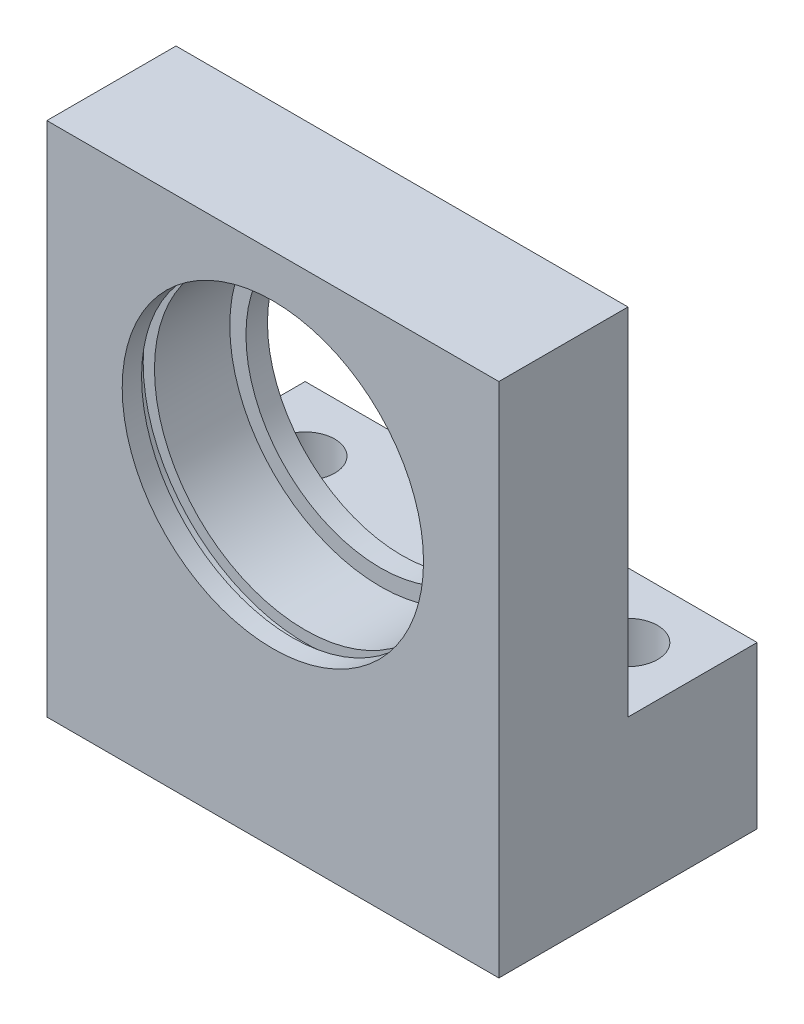
ISO-10303-21;
HEADER;
FILE_DESCRIPTION(('STEP AP214'),'2;1');
FILE_NAME('part.step','',(''),(''),'','','');
FILE_SCHEMA(('AUTOMOTIVE_DESIGN { 1 0 10303 214 1 1 1 1 }'));
ENDSEC;
DATA;
#1=APPLICATION_CONTEXT('core data for automotive mechanical design processes');
#2=APPLICATION_PROTOCOL_DEFINITION('international standard','automotive_design',2000,#1);
#3=PRODUCT_CONTEXT('',#1,'mechanical');
#4=PRODUCT('Part','Part','',(#3));
#5=PRODUCT_RELATED_PRODUCT_CATEGORY('part','',(#4));
#6=PRODUCT_DEFINITION_FORMATION('','',#4);
#7=PRODUCT_DEFINITION_CONTEXT('part definition',#1,'design');
#8=PRODUCT_DEFINITION('design','',#6,#7);
#9=PRODUCT_DEFINITION_SHAPE('','',#8);
#10=(LENGTH_UNIT() NAMED_UNIT(*) SI_UNIT(.MILLI.,.METRE.));
#11=(NAMED_UNIT(*) PLANE_ANGLE_UNIT() SI_UNIT($,.RADIAN.));
#12=(NAMED_UNIT(*) SI_UNIT($,.STERADIAN.) SOLID_ANGLE_UNIT());
#13=UNCERTAINTY_MEASURE_WITH_UNIT(LENGTH_MEASURE(1.E-05),#10,'distance_accuracy_value','');
#14=(GEOMETRIC_REPRESENTATION_CONTEXT(3) GLOBAL_UNCERTAINTY_ASSIGNED_CONTEXT((#13)) GLOBAL_UNIT_ASSIGNED_CONTEXT((#10,
#11,#12)) REPRESENTATION_CONTEXT('',''));
#15=CARTESIAN_POINT('',(0.,0.,0.));
#16=DIRECTION('',(0.,0.,1.));
#17=DIRECTION('',(1.,0.,0.));
#18=AXIS2_PLACEMENT_3D('',#15,#16,#17);
#19=CARTESIAN_POINT('',(21.,18.,-12.));
#20=DIRECTION('',(0.,-1.,0.));
#21=DIRECTION('',(0.,0.,-1.));
#22=AXIS2_PLACEMENT_3D('',#19,#20,#21);
#23=PLANE('',#22);
#24=DIRECTION('',(0.,0.,1.));
#25=VECTOR('',#24,1.);
#26=CARTESIAN_POINT('',(-21.,18.,-12.));
#27=LINE('',#26,#25);
#28=CARTESIAN_POINT('',(-21.,18.,-12.));
#29=VERTEX_POINT('',#28);
#30=CARTESIAN_POINT('',(-21.,18.,0.));
#31=VERTEX_POINT('',#30);
#32=EDGE_CURVE('E84',#29,#31,#27,.T.);
#33=ORIENTED_EDGE('',*,*,#32,.T.);
#34=DIRECTION('',(-1.,0.,0.));
#35=VECTOR('',#34,1.);
#36=CARTESIAN_POINT('',(21.,18.,0.));
#37=LINE('',#36,#35);
#38=CARTESIAN_POINT('',(21.,18.,0.));
#39=VERTEX_POINT('',#38);
#40=EDGE_CURVE('E73',#39,#31,#37,.T.);
#41=ORIENTED_EDGE('',*,*,#40,.F.);
#42=DIRECTION('',(0.,0.,1.));
#43=VECTOR('',#42,1.);
#44=CARTESIAN_POINT('',(21.,18.,-12.));
#45=LINE('',#44,#43);
#46=CARTESIAN_POINT('',(21.,18.,-12.));
#47=VERTEX_POINT('',#46);
#48=EDGE_CURVE('E83',#47,#39,#45,.T.);
#49=ORIENTED_EDGE('',*,*,#48,.F.);
#50=DIRECTION('',(-1.,0.,0.));
#51=VECTOR('',#50,1.);
#52=CARTESIAN_POINT('',(21.,18.,-12.));
#53=LINE('',#52,#51);
#54=EDGE_CURVE('E96',#47,#29,#53,.T.);
#55=ORIENTED_EDGE('',*,*,#54,.T.);
#56=EDGE_LOOP('',(#33,#41,#49,#55));
#57=FACE_BOUND('',#56,.T.);
#58=ADVANCED_FACE('F17',(#57),#23,.F.);
#59=CARTESIAN_POINT('',(-21.,0.,0.));
#60=DIRECTION('',(1.,0.,0.));
#61=DIRECTION('',(0.,0.,-1.));
#62=AXIS2_PLACEMENT_3D('',#59,#60,#61);
#63=PLANE('',#62);
#64=ORIENTED_EDGE('',*,*,#32,.F.);
#65=DIRECTION('',(0.,1.,0.));
#66=VECTOR('',#65,1.);
#67=CARTESIAN_POINT('',(-21.,-15.,-12.));
#68=LINE('',#67,#66);
#69=CARTESIAN_POINT('',(-21.,-15.,-12.));
#70=VERTEX_POINT('',#69);
#71=EDGE_CURVE('E107',#70,#29,#68,.T.);
#72=ORIENTED_EDGE('',*,*,#71,.F.);
#73=DIRECTION('',(0.,0.,1.));
#74=VECTOR('',#73,1.);
#75=CARTESIAN_POINT('',(-21.,-15.,-24.));
#76=LINE('',#75,#74);
#77=CARTESIAN_POINT('',(-21.,-15.,-24.));
#78=VERTEX_POINT('',#77);
#79=EDGE_CURVE('E111',#78,#70,#76,.T.);
#80=ORIENTED_EDGE('',*,*,#79,.F.);
#81=DIRECTION('',(0.,1.,0.));
#82=VECTOR('',#81,1.);
#83=CARTESIAN_POINT('',(-21.,-30.,-24.));
#84=LINE('',#83,#82);
#85=CARTESIAN_POINT('',(-21.,-30.,-24.));
#86=VERTEX_POINT('',#85);
#87=EDGE_CURVE('E115',#86,#78,#84,.T.);
#88=ORIENTED_EDGE('',*,*,#87,.F.);
#89=DIRECTION('',(0.,0.,-1.));
#90=VECTOR('',#89,1.);
#91=CARTESIAN_POINT('',(-21.,-30.,0.));
#92=LINE('',#91,#90);
#93=CARTESIAN_POINT('',(-21.,-30.,0.));
#94=VERTEX_POINT('',#93);
#95=EDGE_CURVE('E92',#94,#86,#92,.T.);
#96=ORIENTED_EDGE('',*,*,#95,.F.);
#97=DIRECTION('',(0.,-1.,0.));
#98=VECTOR('',#97,1.);
#99=CARTESIAN_POINT('',(-21.,18.,0.));
#100=LINE('',#99,#98);
#101=EDGE_CURVE('E77',#31,#94,#100,.T.);
#102=ORIENTED_EDGE('',*,*,#101,.F.);
#103=EDGE_LOOP('',(#64,#72,#80,#88,#96,#102));
#104=FACE_BOUND('',#103,.T.);
#105=ADVANCED_FACE('F89',(#104),#63,.F.);
#106=CARTESIAN_POINT('',(21.,18.,0.));
#107=DIRECTION('',(0.,0.,-1.));
#108=DIRECTION('',(-1.,0.,0.));
#109=AXIS2_PLACEMENT_3D('',#106,#107,#108);
#110=PLANE('',#109);
#111=CARTESIAN_POINT('',(0.,0.,0.));
#112=DIRECTION('',(0.,0.,-1.));
#113=DIRECTION('',(-1.,0.,0.));
#114=AXIS2_PLACEMENT_3D('',#111,#112,#113);
#115=CIRCLE('',#114,14.);
#116=CARTESIAN_POINT('',(-14.,0.,0.));
#117=VERTEX_POINT('',#116);
#118=EDGE_CURVE('E93',#117,#117,#115,.T.);
#119=ORIENTED_EDGE('',*,*,#118,.T.);
#120=EDGE_LOOP('',(#119));
#121=FACE_BOUND('',#120,.T.);
#122=ORIENTED_EDGE('',*,*,#101,.T.);
#123=DIRECTION('',(-1.,0.,0.));
#124=VECTOR('',#123,1.);
#125=CARTESIAN_POINT('',(21.,-30.,0.));
#126=LINE('',#125,#124);
#127=CARTESIAN_POINT('',(21.,-30.,0.));
#128=VERTEX_POINT('',#127);
#129=EDGE_CURVE('E128',#128,#94,#126,.T.);
#130=ORIENTED_EDGE('',*,*,#129,.F.);
#131=DIRECTION('',(0.,-1.,0.));
#132=VECTOR('',#131,1.);
#133=CARTESIAN_POINT('',(21.,18.,0.));
#134=LINE('',#133,#132);
#135=EDGE_CURVE('E79',#39,#128,#134,.T.);
#136=ORIENTED_EDGE('',*,*,#135,.F.);
#137=ORIENTED_EDGE('',*,*,#40,.T.);
#138=EDGE_LOOP('',(#122,#130,#136,#137));
#139=FACE_BOUND('',#138,.T.);
#140=ADVANCED_FACE('F75',(#121,#139),#110,.F.);
#141=CARTESIAN_POINT('',(21.,0.,0.));
#142=DIRECTION('',(1.,0.,0.));
#143=DIRECTION('',(0.,0.,-1.));
#144=AXIS2_PLACEMENT_3D('',#141,#142,#143);
#145=PLANE('',#144);
#146=ORIENTED_EDGE('',*,*,#48,.T.);
#147=ORIENTED_EDGE('',*,*,#135,.T.);
#148=DIRECTION('',(0.,0.,-1.));
#149=VECTOR('',#148,1.);
#150=CARTESIAN_POINT('',(21.,-30.,0.));
#151=LINE('',#150,#149);
#152=CARTESIAN_POINT('',(21.,-30.,-24.));
#153=VERTEX_POINT('',#152);
#154=EDGE_CURVE('E133',#128,#153,#151,.T.);
#155=ORIENTED_EDGE('',*,*,#154,.T.);
#156=DIRECTION('',(0.,1.,0.));
#157=VECTOR('',#156,1.);
#158=CARTESIAN_POINT('',(21.,-30.,-24.));
#159=LINE('',#158,#157);
#160=CARTESIAN_POINT('',(21.,-15.,-24.));
#161=VERTEX_POINT('',#160);
#162=EDGE_CURVE('E138',#153,#161,#159,.T.);
#163=ORIENTED_EDGE('',*,*,#162,.T.);
#164=DIRECTION('',(0.,0.,1.));
#165=VECTOR('',#164,1.);
#166=CARTESIAN_POINT('',(21.,-15.,-24.));
#167=LINE('',#166,#165);
#168=CARTESIAN_POINT('',(21.,-15.,-12.));
#169=VERTEX_POINT('',#168);
#170=EDGE_CURVE('E142',#161,#169,#167,.T.);
#171=ORIENTED_EDGE('',*,*,#170,.T.);
#172=DIRECTION('',(0.,1.,0.));
#173=VECTOR('',#172,1.);
#174=CARTESIAN_POINT('',(21.,-15.,-12.));
#175=LINE('',#174,#173);
#176=EDGE_CURVE('E146',#169,#47,#175,.T.);
#177=ORIENTED_EDGE('',*,*,#176,.T.);
#178=EDGE_LOOP('',(#146,#147,#155,#163,#171,#177));
#179=FACE_BOUND('',#178,.T.);
#180=ADVANCED_FACE('F213',(#179),#145,.T.);
#181=CARTESIAN_POINT('',(21.,-15.,-12.));
#182=DIRECTION('',(0.,0.,1.));
#183=DIRECTION('',(1.,0.,0.));
#184=AXIS2_PLACEMENT_3D('',#181,#182,#183);
#185=PLANE('',#184);
#186=CARTESIAN_POINT('',(0.,0.,-12.));
#187=DIRECTION('',(0.,0.,-1.));
#188=DIRECTION('',(-1.,0.,0.));
#189=AXIS2_PLACEMENT_3D('',#186,#187,#188);
#190=CIRCLE('',#189,12.5);
#191=CARTESIAN_POINT('',(-12.5,0.,-12.));
#192=VERTEX_POINT('',#191);
#193=EDGE_CURVE('E151',#192,#192,#190,.T.);
#194=ORIENTED_EDGE('',*,*,#193,.F.);
#195=EDGE_LOOP('',(#194));
#196=FACE_BOUND('',#195,.T.);
#197=ORIENTED_EDGE('',*,*,#71,.T.);
#198=ORIENTED_EDGE('',*,*,#54,.F.);
#199=ORIENTED_EDGE('',*,*,#176,.F.);
#200=DIRECTION('',(-1.,0.,0.));
#201=VECTOR('',#200,1.);
#202=CARTESIAN_POINT('',(21.,-15.,-12.));
#203=LINE('',#202,#201);
#204=EDGE_CURVE('E32',#169,#70,#203,.T.);
#205=ORIENTED_EDGE('',*,*,#204,.T.);
#206=EDGE_LOOP('',(#197,#198,#199,#205));
#207=FACE_BOUND('',#206,.T.);
#208=ADVANCED_FACE('F217',(#196,#207),#185,.F.);
#209=CARTESIAN_POINT('',(21.,-15.,-24.));
#210=DIRECTION('',(0.,-1.,0.));
#211=DIRECTION('',(0.,0.,-1.));
#212=AXIS2_PLACEMENT_3D('',#209,#210,#211);
#213=PLANE('',#212);
#214=CARTESIAN_POINT('',(15.,-15.,-18.));
#215=DIRECTION('',(0.,1.,0.));
#216=DIRECTION('',(1.,0.,0.));
#217=AXIS2_PLACEMENT_3D('',#214,#215,#216);
#218=CIRCLE('',#217,2.75);
#219=CARTESIAN_POINT('',(17.75,-15.,-18.));
#220=VERTEX_POINT('',#219);
#221=EDGE_CURVE('E157',#220,#220,#218,.T.);
#222=ORIENTED_EDGE('',*,*,#221,.F.);
#223=EDGE_LOOP('',(#222));
#224=FACE_BOUND('',#223,.T.);
#225=CARTESIAN_POINT('',(-15.,-15.,-18.));
#226=DIRECTION('',(0.,1.,0.));
#227=DIRECTION('',(1.,0.,0.));
#228=AXIS2_PLACEMENT_3D('',#225,#226,#227);
#229=CIRCLE('',#228,2.75);
#230=CARTESIAN_POINT('',(-12.25,-15.,-18.));
#231=VERTEX_POINT('',#230);
#232=EDGE_CURVE('E162',#231,#231,#229,.T.);
#233=ORIENTED_EDGE('',*,*,#232,.F.);
#234=EDGE_LOOP('',(#233));
#235=FACE_BOUND('',#234,.T.);
#236=ORIENTED_EDGE('',*,*,#79,.T.);
#237=ORIENTED_EDGE('',*,*,#204,.F.);
#238=ORIENTED_EDGE('',*,*,#170,.F.);
#239=DIRECTION('',(-1.,0.,0.));
#240=VECTOR('',#239,1.);
#241=CARTESIAN_POINT('',(21.,-15.,-24.));
#242=LINE('',#241,#240);
#243=EDGE_CURVE('E40',#161,#78,#242,.T.);
#244=ORIENTED_EDGE('',*,*,#243,.T.);
#245=EDGE_LOOP('',(#236,#237,#238,#244));
#246=FACE_BOUND('',#245,.T.);
#247=ADVANCED_FACE('F221',(#224,#235,#246),#213,.F.);
#248=CARTESIAN_POINT('',(21.,-30.,-24.));
#249=DIRECTION('',(0.,0.,1.));
#250=DIRECTION('',(1.,0.,0.));
#251=AXIS2_PLACEMENT_3D('',#248,#249,#250);
#252=PLANE('',#251);
#253=ORIENTED_EDGE('',*,*,#87,.T.);
#254=ORIENTED_EDGE('',*,*,#243,.F.);
#255=ORIENTED_EDGE('',*,*,#162,.F.);
#256=DIRECTION('',(-1.,0.,0.));
#257=VECTOR('',#256,1.);
#258=CARTESIAN_POINT('',(21.,-30.,-24.));
#259=LINE('',#258,#257);
#260=EDGE_CURVE('E166',#153,#86,#259,.T.);
#261=ORIENTED_EDGE('',*,*,#260,.T.);
#262=EDGE_LOOP('',(#253,#254,#255,#261));
#263=FACE_BOUND('',#262,.T.);
#264=ADVANCED_FACE('F225',(#263),#252,.F.);
#265=CARTESIAN_POINT('',(21.,-30.,0.));
#266=DIRECTION('',(0.,1.,0.));
#267=DIRECTION('',(0.,0.,1.));
#268=AXIS2_PLACEMENT_3D('',#265,#266,#267);
#269=PLANE('',#268);
#270=CARTESIAN_POINT('',(15.,-30.,-18.));
#271=DIRECTION('',(0.,1.,0.));
#272=DIRECTION('',(1.,0.,0.));
#273=AXIS2_PLACEMENT_3D('',#270,#271,#272);
#274=CIRCLE('',#273,2.75);
#275=CARTESIAN_POINT('',(17.75,-30.,-18.));
#276=VERTEX_POINT('',#275);
#277=EDGE_CURVE('E171',#276,#276,#274,.T.);
#278=ORIENTED_EDGE('',*,*,#277,.T.);
#279=EDGE_LOOP('',(#278));
#280=FACE_BOUND('',#279,.T.);
#281=CARTESIAN_POINT('',(-15.,-30.,-18.));
#282=DIRECTION('',(0.,1.,0.));
#283=DIRECTION('',(1.,0.,0.));
#284=AXIS2_PLACEMENT_3D('',#281,#282,#283);
#285=CIRCLE('',#284,2.75);
#286=CARTESIAN_POINT('',(-12.25,-30.,-18.));
#287=VERTEX_POINT('',#286);
#288=EDGE_CURVE('E176',#287,#287,#285,.T.);
#289=ORIENTED_EDGE('',*,*,#288,.T.);
#290=EDGE_LOOP('',(#289));
#291=FACE_BOUND('',#290,.T.);
#292=ORIENTED_EDGE('',*,*,#95,.T.);
#293=ORIENTED_EDGE('',*,*,#260,.F.);
#294=ORIENTED_EDGE('',*,*,#154,.F.);
#295=ORIENTED_EDGE('',*,*,#129,.T.);
#296=EDGE_LOOP('',(#292,#293,#294,#295));
#297=FACE_BOUND('',#296,.T.);
#298=ADVANCED_FACE('F229',(#280,#291,#297),#269,.F.);
#299=CARTESIAN_POINT('',(0.,0.,-12.));
#300=DIRECTION('',(0.,0.,-1.));
#301=DIRECTION('',(-1.,0.,0.));
#302=AXIS2_PLACEMENT_3D('',#299,#300,#301);
#303=CYLINDRICAL_SURFACE('',#302,14.);
#304=CARTESIAN_POINT('',(0.,0.,-1.8));
#305=DIRECTION('',(0.,0.,-1.));
#306=DIRECTION('',(-1.,0.,0.));
#307=AXIS2_PLACEMENT_3D('',#304,#305,#306);
#308=CIRCLE('',#307,14.);
#309=CARTESIAN_POINT('',(-14.,0.,-1.8));
#310=VERTEX_POINT('',#309);
#311=EDGE_CURVE('E179',#310,#310,#308,.T.);
#312=ORIENTED_EDGE('',*,*,#311,.T.);
#313=EDGE_LOOP('',(#312));
#314=FACE_BOUND('',#313,.T.);
#315=ORIENTED_EDGE('',*,*,#118,.F.);
#316=EDGE_LOOP('',(#315));
#317=FACE_BOUND('',#316,.T.);
#318=ADVANCED_FACE('F232',(#314,#317),#303,.F.);
#319=CARTESIAN_POINT('',(0.,0.,-12.));
#320=DIRECTION('',(0.,0.,-1.));
#321=DIRECTION('',(-1.,0.,0.));
#322=AXIS2_PLACEMENT_3D('',#319,#320,#321);
#323=CYLINDRICAL_SURFACE('',#322,12.5);
#324=ORIENTED_EDGE('',*,*,#193,.T.);
#325=EDGE_LOOP('',(#324));
#326=FACE_BOUND('',#325,.T.);
#327=CARTESIAN_POINT('',(0.,0.,-10.));
#328=DIRECTION('',(0.,0.,-1.));
#329=DIRECTION('',(-1.,0.,0.));
#330=AXIS2_PLACEMENT_3D('',#327,#328,#329);
#331=CIRCLE('',#330,12.5);
#332=CARTESIAN_POINT('',(-12.5,0.,-10.));
#333=VERTEX_POINT('',#332);
#334=EDGE_CURVE('E182',#333,#333,#331,.T.);
#335=ORIENTED_EDGE('',*,*,#334,.F.);
#336=EDGE_LOOP('',(#335));
#337=FACE_BOUND('',#336,.T.);
#338=ADVANCED_FACE('F236',(#326,#337),#323,.F.);
#339=CARTESIAN_POINT('',(15.,-15.,-18.));
#340=DIRECTION('',(0.,-1.,0.));
#341=DIRECTION('',(0.,0.,-1.));
#342=AXIS2_PLACEMENT_3D('',#339,#340,#341);
#343=CYLINDRICAL_SURFACE('',#342,2.75);
#344=ORIENTED_EDGE('',*,*,#221,.T.);
#345=EDGE_LOOP('',(#344));
#346=FACE_BOUND('',#345,.T.);
#347=ORIENTED_EDGE('',*,*,#277,.F.);
#348=EDGE_LOOP('',(#347));
#349=FACE_BOUND('',#348,.T.);
#350=ADVANCED_FACE('F240',(#346,#349),#343,.F.);
#351=CARTESIAN_POINT('',(-15.,-15.,-18.));
#352=DIRECTION('',(0.,-1.,0.));
#353=DIRECTION('',(0.,0.,-1.));
#354=AXIS2_PLACEMENT_3D('',#351,#352,#353);
#355=CYLINDRICAL_SURFACE('',#354,2.75);
#356=ORIENTED_EDGE('',*,*,#232,.T.);
#357=EDGE_LOOP('',(#356));
#358=FACE_BOUND('',#357,.T.);
#359=ORIENTED_EDGE('',*,*,#288,.F.);
#360=EDGE_LOOP('',(#359));
#361=FACE_BOUND('',#360,.T.);
#362=ADVANCED_FACE('F244',(#358,#361),#355,.F.);
#363=CARTESIAN_POINT('',(0.,14.,-1.8));
#364=DIRECTION('',(0.,0.,-1.));
#365=DIRECTION('',(-1.,0.,0.));
#366=AXIS2_PLACEMENT_3D('',#363,#364,#365);
#367=PLANE('',#366);
#368=CARTESIAN_POINT('',(0.,0.,-1.8));
#369=DIRECTION('',(0.,0.,-1.));
#370=DIRECTION('',(-1.,0.,0.));
#371=AXIS2_PLACEMENT_3D('',#368,#369,#370);
#372=CIRCLE('',#371,15.05);
#373=CARTESIAN_POINT('',(-15.05,0.,-1.8));
#374=VERTEX_POINT('',#373);
#375=EDGE_CURVE('E185',#374,#374,#372,.T.);
#376=ORIENTED_EDGE('',*,*,#375,.T.);
#377=EDGE_LOOP('',(#376));
#378=FACE_BOUND('',#377,.T.);
#379=ORIENTED_EDGE('',*,*,#311,.F.);
#380=EDGE_LOOP('',(#379));
#381=FACE_BOUND('',#380,.T.);
#382=ADVANCED_FACE('F248',(#378,#381),#367,.T.);
#383=CARTESIAN_POINT('',(0.,14.,-10.));
#384=DIRECTION('',(0.,0.,1.));
#385=DIRECTION('',(1.,0.,0.));
#386=AXIS2_PLACEMENT_3D('',#383,#384,#385);
#387=PLANE('',#386);
#388=ORIENTED_EDGE('',*,*,#334,.T.);
#389=EDGE_LOOP('',(#388));
#390=FACE_BOUND('',#389,.T.);
#391=CARTESIAN_POINT('',(0.,0.,-10.));
#392=DIRECTION('',(0.,0.,-1.));
#393=DIRECTION('',(-1.,0.,0.));
#394=AXIS2_PLACEMENT_3D('',#391,#392,#393);
#395=CIRCLE('',#394,14.);
#396=CARTESIAN_POINT('',(-14.,0.,-10.));
#397=VERTEX_POINT('',#396);
#398=EDGE_CURVE('E188',#397,#397,#395,.T.);
#399=ORIENTED_EDGE('',*,*,#398,.F.);
#400=EDGE_LOOP('',(#399));
#401=FACE_BOUND('',#400,.T.);
#402=ADVANCED_FACE('F252',(#390,#401),#387,.T.);
#403=CARTESIAN_POINT('',(0.,0.,-12.));
#404=DIRECTION('',(0.,0.,-1.));
#405=DIRECTION('',(-1.,0.,0.));
#406=AXIS2_PLACEMENT_3D('',#403,#404,#405);
#407=CYLINDRICAL_SURFACE('',#406,15.05);
#408=CARTESIAN_POINT('',(0.,0.,-3.));
#409=DIRECTION('',(0.,0.,-1.));
#410=DIRECTION('',(-1.,0.,0.));
#411=AXIS2_PLACEMENT_3D('',#408,#409,#410);
#412=CIRCLE('',#411,15.05);
#413=CARTESIAN_POINT('',(-15.05,0.,-3.));
#414=VERTEX_POINT('',#413);
#415=EDGE_CURVE('E25',#414,#414,#412,.T.);
#416=ORIENTED_EDGE('',*,*,#415,.T.);
#417=EDGE_LOOP('',(#416));
#418=FACE_BOUND('',#417,.T.);
#419=ORIENTED_EDGE('',*,*,#375,.F.);
#420=EDGE_LOOP('',(#419));
#421=FACE_BOUND('',#420,.T.);
#422=ADVANCED_FACE('F193',(#418,#421),#407,.F.);
#423=CARTESIAN_POINT('',(0.,0.,-12.));
#424=DIRECTION('',(0.,0.,-1.));
#425=DIRECTION('',(-1.,0.,0.));
#426=AXIS2_PLACEMENT_3D('',#423,#424,#425);
#427=CYLINDRICAL_SURFACE('',#426,14.);
#428=ORIENTED_EDGE('',*,*,#398,.T.);
#429=EDGE_LOOP('',(#428));
#430=FACE_BOUND('',#429,.T.);
#431=CARTESIAN_POINT('',(0.,0.,-3.));
#432=DIRECTION('',(0.,0.,-1.));
#433=DIRECTION('',(-1.,0.,0.));
#434=AXIS2_PLACEMENT_3D('',#431,#432,#433);
#435=CIRCLE('',#434,14.);
#436=CARTESIAN_POINT('',(-14.,0.,-3.));
#437=VERTEX_POINT('',#436);
#438=EDGE_CURVE('E11',#437,#437,#435,.T.);
#439=ORIENTED_EDGE('',*,*,#438,.F.);
#440=EDGE_LOOP('',(#439));
#441=FACE_BOUND('',#440,.T.);
#442=ADVANCED_FACE('F197',(#430,#441),#427,.F.);
#443=CARTESIAN_POINT('',(0.,15.05,-3.));
#444=DIRECTION('',(0.,0.,1.));
#445=DIRECTION('',(1.,0.,0.));
#446=AXIS2_PLACEMENT_3D('',#443,#444,#445);
#447=PLANE('',#446);
#448=ORIENTED_EDGE('',*,*,#438,.T.);
#449=EDGE_LOOP('',(#448));
#450=FACE_BOUND('',#449,.T.);
#451=ORIENTED_EDGE('',*,*,#415,.F.);
#452=EDGE_LOOP('',(#451));
#453=FACE_BOUND('',#452,.T.);
#454=ADVANCED_FACE('F19',(#450,#453),#447,.T.);
#455=CLOSED_SHELL('',(#58,#105,#140,#180,#208,#247,#264,#298,#318,#338,#350,#362,#382,#402,#422,
#442,#454));
#456=MANIFOLD_SOLID_BREP('B1',#455);
#457=ADVANCED_BREP_SHAPE_REPRESENTATION('',(#18,#456),#14);
#458=SHAPE_DEFINITION_REPRESENTATION(#9,#457);
ENDSEC;
END-ISO-10303-21;
